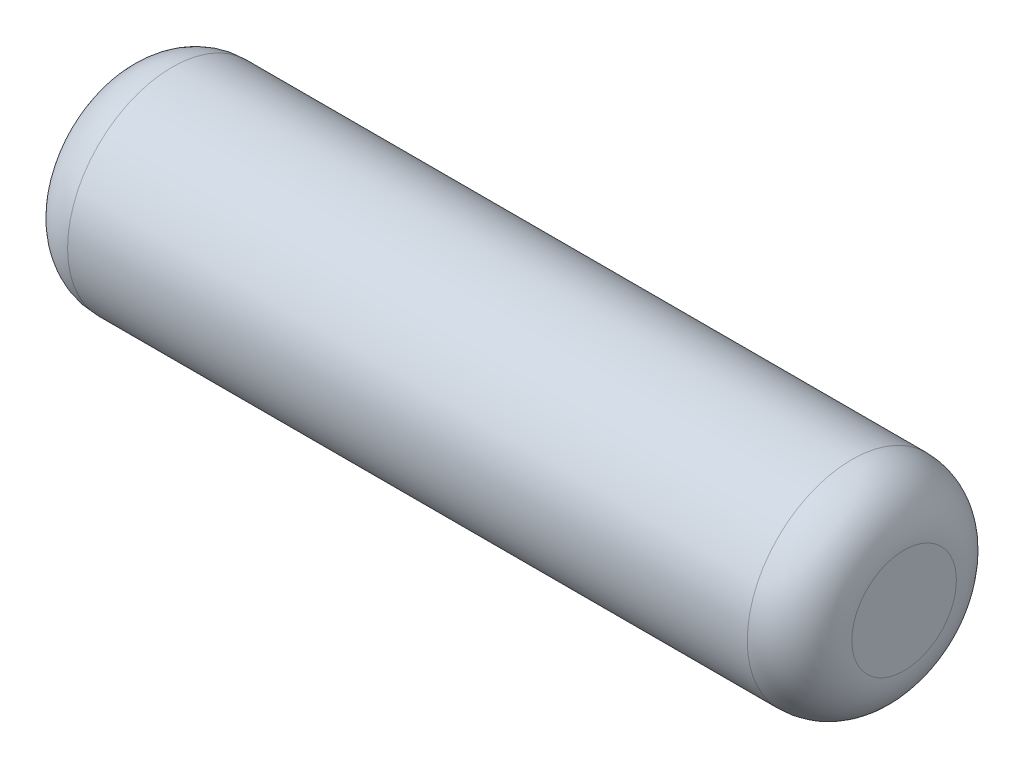
ISO-10303-21;
HEADER;
FILE_DESCRIPTION(('STEP AP214'),'2;1');
FILE_NAME('part.step','',(''),(''),'','','');
FILE_SCHEMA(('AUTOMOTIVE_DESIGN { 1 0 10303 214 1 1 1 1 }'));
ENDSEC;
DATA;
#1=APPLICATION_CONTEXT('core data for automotive mechanical design processes');
#2=APPLICATION_PROTOCOL_DEFINITION('international standard','automotive_design',2000,#1);
#3=PRODUCT_CONTEXT('',#1,'mechanical');
#4=PRODUCT('Part','Part','',(#3));
#5=PRODUCT_RELATED_PRODUCT_CATEGORY('part','',(#4));
#6=PRODUCT_DEFINITION_FORMATION('','',#4);
#7=PRODUCT_DEFINITION_CONTEXT('part definition',#1,'design');
#8=PRODUCT_DEFINITION('design','',#6,#7);
#9=PRODUCT_DEFINITION_SHAPE('','',#8);
#10=(LENGTH_UNIT() NAMED_UNIT(*) SI_UNIT(.MILLI.,.METRE.));
#11=(NAMED_UNIT(*) PLANE_ANGLE_UNIT() SI_UNIT($,.RADIAN.));
#12=(NAMED_UNIT(*) SI_UNIT($,.STERADIAN.) SOLID_ANGLE_UNIT());
#13=UNCERTAINTY_MEASURE_WITH_UNIT(LENGTH_MEASURE(1.E-05),#10,'distance_accuracy_value','');
#14=(GEOMETRIC_REPRESENTATION_CONTEXT(3) GLOBAL_UNCERTAINTY_ASSIGNED_CONTEXT((#13)) GLOBAL_UNIT_ASSIGNED_CONTEXT((#10,
#11,#12)) REPRESENTATION_CONTEXT('',''));
#15=CARTESIAN_POINT('',(0.,0.,0.));
#16=DIRECTION('',(0.,0.,1.));
#17=DIRECTION('',(1.,0.,0.));
#18=AXIS2_PLACEMENT_3D('',#15,#16,#17);
#19=CARTESIAN_POINT('',(7.5,0.,0.));
#20=DIRECTION('',(-1.,0.,0.));
#21=DIRECTION('',(0.,0.,1.));
#22=AXIS2_PLACEMENT_3D('',#19,#20,#21);
#23=CYLINDRICAL_SURFACE('',#22,2.);
#24=CARTESIAN_POINT('',(-6.5,0.,0.));
#25=DIRECTION('',(1.,0.,0.));
#26=DIRECTION('',(0.,0.,-1.));
#27=AXIS2_PLACEMENT_3D('',#24,#25,#26);
#28=CIRCLE('',#27,2.);
#29=CARTESIAN_POINT('',(-6.5,0.,-2.));
#30=VERTEX_POINT('',#29);
#31=EDGE_CURVE('E44',#30,#30,#28,.T.);
#32=ORIENTED_EDGE('',*,*,#31,.T.);
#33=EDGE_LOOP('',(#32));
#34=FACE_BOUND('',#33,.T.);
#35=CARTESIAN_POINT('',(6.5,0.,0.));
#36=DIRECTION('',(1.,0.,0.));
#37=DIRECTION('',(0.,0.,-1.));
#38=AXIS2_PLACEMENT_3D('',#35,#36,#37);
#39=CIRCLE('',#38,2.);
#40=CARTESIAN_POINT('',(6.5,0.,-2.));
#41=VERTEX_POINT('',#40);
#42=EDGE_CURVE('E48',#41,#41,#39,.F.);
#43=ORIENTED_EDGE('',*,*,#42,.T.);
#44=EDGE_LOOP('',(#43));
#45=FACE_BOUND('',#44,.T.);
#46=ADVANCED_FACE('F33',(#34,#45),#23,.T.);
#47=CARTESIAN_POINT('',(7.5,0.,0.));
#48=DIRECTION('',(1.,0.,0.));
#49=DIRECTION('',(0.,0.,-1.));
#50=AXIS2_PLACEMENT_3D('',#47,#48,#49);
#51=PLANE('',#50);
#52=CARTESIAN_POINT('',(7.5,0.,0.));
#53=DIRECTION('',(1.,0.,0.));
#54=DIRECTION('',(0.,0.,-1.));
#55=AXIS2_PLACEMENT_3D('',#52,#53,#54);
#56=CIRCLE('',#55,1.);
#57=CARTESIAN_POINT('',(7.5,0.,-1.));
#58=VERTEX_POINT('',#57);
#59=EDGE_CURVE('E10',#58,#58,#56,.T.);
#60=ORIENTED_EDGE('',*,*,#59,.T.);
#61=EDGE_LOOP('',(#60));
#62=FACE_BOUND('',#61,.T.);
#63=ADVANCED_FACE('F64',(#62),#51,.T.);
#64=CARTESIAN_POINT('',(-7.5,0.,0.));
#65=DIRECTION('',(1.,0.,0.));
#66=DIRECTION('',(0.,0.,-1.));
#67=AXIS2_PLACEMENT_3D('',#64,#65,#66);
#68=PLANE('',#67);
#69=CARTESIAN_POINT('',(-7.5,0.,0.));
#70=DIRECTION('',(1.,0.,0.));
#71=DIRECTION('',(0.,0.,-1.));
#72=AXIS2_PLACEMENT_3D('',#69,#70,#71);
#73=CIRCLE('',#72,1.);
#74=CARTESIAN_POINT('',(-7.5,0.,-1.));
#75=VERTEX_POINT('',#74);
#76=EDGE_CURVE('E40',#75,#75,#73,.F.);
#77=ORIENTED_EDGE('',*,*,#76,.T.);
#78=EDGE_LOOP('',(#77));
#79=FACE_BOUND('',#78,.T.);
#80=ADVANCED_FACE('F61',(#79),#68,.F.);
#81=CARTESIAN_POINT('',(-6.5,0.,0.));
#82=DIRECTION('',(1.,0.,0.));
#83=DIRECTION('',(0.,0.,-1.));
#84=AXIS2_PLACEMENT_3D('',#81,#82,#83);
#85=DEGENERATE_TOROIDAL_SURFACE('',#84,1.,1.,.T.);
#86=ORIENTED_EDGE('',*,*,#76,.F.);
#87=EDGE_LOOP('',(#86));
#88=FACE_BOUND('',#87,.T.);
#89=ORIENTED_EDGE('',*,*,#31,.F.);
#90=EDGE_LOOP('',(#89));
#91=FACE_BOUND('',#90,.T.);
#92=ADVANCED_FACE('F57',(#88,#91),#85,.T.);
#93=CARTESIAN_POINT('',(6.5,0.,0.));
#94=DIRECTION('',(1.,0.,0.));
#95=DIRECTION('',(0.,0.,-1.));
#96=AXIS2_PLACEMENT_3D('',#93,#94,#95);
#97=DEGENERATE_TOROIDAL_SURFACE('',#96,1.,1.,.T.);
#98=ORIENTED_EDGE('',*,*,#42,.F.);
#99=EDGE_LOOP('',(#98));
#100=FACE_BOUND('',#99,.T.);
#101=ORIENTED_EDGE('',*,*,#59,.F.);
#102=EDGE_LOOP('',(#101));
#103=FACE_BOUND('',#102,.T.);
#104=ADVANCED_FACE('F35',(#100,#103),#97,.T.);
#105=CLOSED_SHELL('',(#46,#63,#80,#92,#104));
#106=MANIFOLD_SOLID_BREP('B2',#105);
#107=ADVANCED_BREP_SHAPE_REPRESENTATION('',(#18,#106),#14);
#108=SHAPE_DEFINITION_REPRESENTATION(#9,#107);
ENDSEC;
END-ISO-10303-21;
